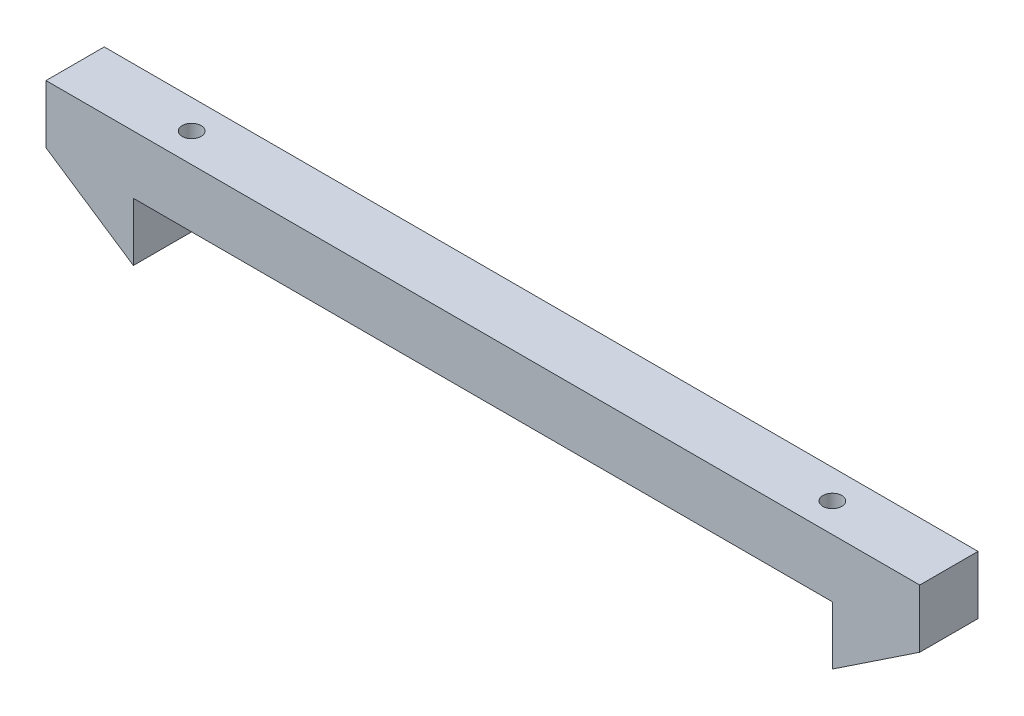
ISO-10303-21;
HEADER;
FILE_DESCRIPTION(('STEP AP214'),'2;1');
FILE_NAME('part.step','',(''),(''),'','','');
FILE_SCHEMA(('AUTOMOTIVE_DESIGN { 1 0 10303 214 1 1 1 1 }'));
ENDSEC;
DATA;
#1=APPLICATION_CONTEXT('core data for automotive mechanical design processes');
#2=APPLICATION_PROTOCOL_DEFINITION('international standard','automotive_design',2000,#1);
#3=PRODUCT_CONTEXT('',#1,'mechanical');
#4=PRODUCT('Part','Part','',(#3));
#5=PRODUCT_RELATED_PRODUCT_CATEGORY('part','',(#4));
#6=PRODUCT_DEFINITION_FORMATION('','',#4);
#7=PRODUCT_DEFINITION_CONTEXT('part definition',#1,'design');
#8=PRODUCT_DEFINITION('design','',#6,#7);
#9=PRODUCT_DEFINITION_SHAPE('','',#8);
#10=(LENGTH_UNIT() NAMED_UNIT(*) SI_UNIT(.MILLI.,.METRE.));
#11=(NAMED_UNIT(*) PLANE_ANGLE_UNIT() SI_UNIT($,.RADIAN.));
#12=(NAMED_UNIT(*) SI_UNIT($,.STERADIAN.) SOLID_ANGLE_UNIT());
#13=UNCERTAINTY_MEASURE_WITH_UNIT(LENGTH_MEASURE(1.E-05),#10,'distance_accuracy_value','');
#14=(GEOMETRIC_REPRESENTATION_CONTEXT(3) GLOBAL_UNCERTAINTY_ASSIGNED_CONTEXT((#13)) GLOBAL_UNIT_ASSIGNED_CONTEXT((#10,
#11,#12)) REPRESENTATION_CONTEXT('',''));
#15=CARTESIAN_POINT('',(0.,0.,0.));
#16=DIRECTION('',(0.,0.,1.));
#17=DIRECTION('',(1.,0.,0.));
#18=AXIS2_PLACEMENT_3D('',#15,#16,#17);
#19=CARTESIAN_POINT('',(-48.,-8.00000000000001,8.));
#20=DIRECTION('',(-1.,0.,0.));
#21=DIRECTION('',(0.,0.,1.));
#22=AXIS2_PLACEMENT_3D('',#19,#20,#21);
#23=PLANE('',#22);
#24=DIRECTION('',(0.,1.,0.));
#25=VECTOR('',#24,1.);
#26=CARTESIAN_POINT('',(-48.,-8.00000000000001,0.));
#27=LINE('',#26,#25);
#28=CARTESIAN_POINT('',(-48.,-8.00000000000001,0.));
#29=VERTEX_POINT('',#28);
#30=CARTESIAN_POINT('',(-48.,0.,0.));
#31=VERTEX_POINT('',#30);
#32=EDGE_CURVE('E145',#29,#31,#27,.T.);
#33=ORIENTED_EDGE('',*,*,#32,.T.);
#34=DIRECTION('',(0.,0.,-1.));
#35=VECTOR('',#34,1.);
#36=CARTESIAN_POINT('',(-48.,0.,8.));
#37=LINE('',#36,#35);
#38=CARTESIAN_POINT('',(-48.,0.,8.));
#39=VERTEX_POINT('',#38);
#40=EDGE_CURVE('E11',#39,#31,#37,.T.);
#41=ORIENTED_EDGE('',*,*,#40,.F.);
#42=DIRECTION('',(0.,1.,0.));
#43=VECTOR('',#42,1.);
#44=CARTESIAN_POINT('',(-48.,-8.00000000000001,8.));
#45=LINE('',#44,#43);
#46=CARTESIAN_POINT('',(-48.,-8.00000000000001,8.));
#47=VERTEX_POINT('',#46);
#48=EDGE_CURVE('E170',#47,#39,#45,.T.);
#49=ORIENTED_EDGE('',*,*,#48,.F.);
#50=DIRECTION('',(0.,0.,-1.));
#51=VECTOR('',#50,1.);
#52=CARTESIAN_POINT('',(-48.,-8.00000000000001,8.));
#53=LINE('',#52,#51);
#54=EDGE_CURVE('E137',#47,#29,#53,.T.);
#55=ORIENTED_EDGE('',*,*,#54,.T.);
#56=EDGE_LOOP('',(#33,#41,#49,#55));
#57=FACE_BOUND('',#56,.T.);
#58=ADVANCED_FACE('F43',(#57),#23,.F.);
#59=CARTESIAN_POINT('',(-48.,0.,8.));
#60=DIRECTION('',(0.,1.,0.));
#61=DIRECTION('',(-1.,0.,0.));
#62=AXIS2_PLACEMENT_3D('',#59,#60,#61);
#63=PLANE('',#62);
#64=CARTESIAN_POINT('',(-44.,0.,4.));
#65=DIRECTION('',(0.,-1.,0.));
#66=DIRECTION('',(1.,0.,0.));
#67=AXIS2_PLACEMENT_3D('',#64,#65,#66);
#68=CIRCLE('',#67,1.29999999999999);
#69=CARTESIAN_POINT('',(-42.7,0.,4.));
#70=VERTEX_POINT('',#69);
#71=EDGE_CURVE('E214',#70,#70,#68,.T.);
#72=ORIENTED_EDGE('',*,*,#71,.F.);
#73=EDGE_LOOP('',(#72));
#74=FACE_BOUND('',#73,.T.);
#75=CARTESIAN_POINT('',(44.,0.,4.));
#76=DIRECTION('',(0.,-1.,0.));
#77=DIRECTION('',(-1.,0.,0.));
#78=AXIS2_PLACEMENT_3D('',#75,#76,#77);
#79=CIRCLE('',#78,1.29999999999999);
#80=CARTESIAN_POINT('',(42.7,0.,4.));
#81=VERTEX_POINT('',#80);
#82=EDGE_CURVE('E211',#81,#81,#79,.T.);
#83=ORIENTED_EDGE('',*,*,#82,.F.);
#84=EDGE_LOOP('',(#83));
#85=FACE_BOUND('',#84,.T.);
#86=DIRECTION('',(1.,0.,0.));
#87=VECTOR('',#86,1.);
#88=CARTESIAN_POINT('',(-48.,0.,0.));
#89=LINE('',#88,#87);
#90=CARTESIAN_POINT('',(48.,0.,0.));
#91=VERTEX_POINT('',#90);
#92=EDGE_CURVE('E146',#31,#91,#89,.T.);
#93=ORIENTED_EDGE('',*,*,#92,.T.);
#94=DIRECTION('',(0.,0.,-1.));
#95=VECTOR('',#94,1.);
#96=CARTESIAN_POINT('',(48.,0.,8.));
#97=LINE('',#96,#95);
#98=CARTESIAN_POINT('',(48.,0.,8.));
#99=VERTEX_POINT('',#98);
#100=EDGE_CURVE('E55',#99,#91,#97,.T.);
#101=ORIENTED_EDGE('',*,*,#100,.F.);
#102=DIRECTION('',(1.,0.,0.));
#103=VECTOR('',#102,1.);
#104=CARTESIAN_POINT('',(-48.,0.,8.));
#105=LINE('',#104,#103);
#106=EDGE_CURVE('E103',#39,#99,#105,.T.);
#107=ORIENTED_EDGE('',*,*,#106,.F.);
#108=ORIENTED_EDGE('',*,*,#40,.T.);
#109=EDGE_LOOP('',(#93,#101,#107,#108));
#110=FACE_BOUND('',#109,.T.);
#111=ADVANCED_FACE('F228',(#74,#85,#110),#63,.F.);
#112=CARTESIAN_POINT('',(48.,0.,8.));
#113=DIRECTION('',(1.,0.,0.));
#114=DIRECTION('',(0.,0.,-1.));
#115=AXIS2_PLACEMENT_3D('',#112,#113,#114);
#116=PLANE('',#115);
#117=DIRECTION('',(0.,-1.,0.));
#118=VECTOR('',#117,1.);
#119=CARTESIAN_POINT('',(48.,0.,0.));
#120=LINE('',#119,#118);
#121=CARTESIAN_POINT('',(48.,-7.99999999999998,0.));
#122=VERTEX_POINT('',#121);
#123=EDGE_CURVE('E155',#91,#122,#120,.T.);
#124=ORIENTED_EDGE('',*,*,#123,.T.);
#125=DIRECTION('',(0.,0.,-1.));
#126=VECTOR('',#125,1.);
#127=CARTESIAN_POINT('',(48.,-7.99999999999998,8.));
#128=LINE('',#127,#126);
#129=CARTESIAN_POINT('',(48.,-7.99999999999998,8.));
#130=VERTEX_POINT('',#129);
#131=EDGE_CURVE('E176',#130,#122,#128,.T.);
#132=ORIENTED_EDGE('',*,*,#131,.F.);
#133=DIRECTION('',(0.,-1.,0.));
#134=VECTOR('',#133,1.);
#135=CARTESIAN_POINT('',(48.,0.,8.));
#136=LINE('',#135,#134);
#137=EDGE_CURVE('E189',#99,#130,#136,.T.);
#138=ORIENTED_EDGE('',*,*,#137,.F.);
#139=ORIENTED_EDGE('',*,*,#100,.T.);
#140=EDGE_LOOP('',(#124,#132,#138,#139));
#141=FACE_BOUND('',#140,.T.);
#142=ADVANCED_FACE('F187',(#141),#116,.F.);
#143=CARTESIAN_POINT('',(48.,-7.99999999999998,8.));
#144=DIRECTION('',(-0.554700196225229,0.832050294337844,0.));
#145=DIRECTION('',(-0.832050294337844,-0.554700196225229,0.));
#146=AXIS2_PLACEMENT_3D('',#143,#144,#145);
#147=PLANE('',#146);
#148=DIRECTION('',(0.832050294337844,0.554700196225229,0.));
#149=VECTOR('',#148,1.);
#150=CARTESIAN_POINT('',(48.,-7.99999999999998,0.));
#151=LINE('',#150,#149);
#152=CARTESIAN_POINT('',(60.,0.,0.));
#153=VERTEX_POINT('',#152);
#154=EDGE_CURVE('E154',#122,#153,#151,.T.);
#155=ORIENTED_EDGE('',*,*,#154,.T.);
#156=DIRECTION('',(0.,0.,-1.));
#157=VECTOR('',#156,1.);
#158=CARTESIAN_POINT('',(60.,0.,8.));
#159=LINE('',#158,#157);
#160=CARTESIAN_POINT('',(60.,0.,8.));
#161=VERTEX_POINT('',#160);
#162=EDGE_CURVE('E171',#161,#153,#159,.T.);
#163=ORIENTED_EDGE('',*,*,#162,.F.);
#164=DIRECTION('',(0.832050294337844,0.554700196225229,0.));
#165=VECTOR('',#164,1.);
#166=CARTESIAN_POINT('',(48.,-7.99999999999998,8.));
#167=LINE('',#166,#165);
#168=EDGE_CURVE('E203',#130,#161,#167,.T.);
#169=ORIENTED_EDGE('',*,*,#168,.F.);
#170=ORIENTED_EDGE('',*,*,#131,.T.);
#171=EDGE_LOOP('',(#155,#163,#169,#170));
#172=FACE_BOUND('',#171,.T.);
#173=ADVANCED_FACE('F198',(#172),#147,.F.);
#174=CARTESIAN_POINT('',(60.,0.,8.));
#175=DIRECTION('',(-1.,0.,0.));
#176=DIRECTION('',(0.,0.,1.));
#177=AXIS2_PLACEMENT_3D('',#174,#175,#176);
#178=PLANE('',#177);
#179=DIRECTION('',(0.,1.,0.));
#180=VECTOR('',#179,1.);
#181=CARTESIAN_POINT('',(60.,0.,0.));
#182=LINE('',#181,#180);
#183=CARTESIAN_POINT('',(60.,8.00000000000002,0.));
#184=VERTEX_POINT('',#183);
#185=EDGE_CURVE('E158',#153,#184,#182,.T.);
#186=ORIENTED_EDGE('',*,*,#185,.T.);
#187=DIRECTION('',(0.,0.,-1.));
#188=VECTOR('',#187,1.);
#189=CARTESIAN_POINT('',(60.,8.00000000000002,8.));
#190=LINE('',#189,#188);
#191=CARTESIAN_POINT('',(60.,8.00000000000002,8.));
#192=VERTEX_POINT('',#191);
#193=EDGE_CURVE('E134',#192,#184,#190,.T.);
#194=ORIENTED_EDGE('',*,*,#193,.F.);
#195=DIRECTION('',(0.,1.,0.));
#196=VECTOR('',#195,1.);
#197=CARTESIAN_POINT('',(60.,0.,8.));
#198=LINE('',#197,#196);
#199=EDGE_CURVE('E125',#161,#192,#198,.T.);
#200=ORIENTED_EDGE('',*,*,#199,.F.);
#201=ORIENTED_EDGE('',*,*,#162,.T.);
#202=EDGE_LOOP('',(#186,#194,#200,#201));
#203=FACE_BOUND('',#202,.T.);
#204=ADVANCED_FACE('F200',(#203),#178,.F.);
#205=CARTESIAN_POINT('',(60.,8.00000000000002,8.));
#206=DIRECTION('',(0.,-1.,0.));
#207=DIRECTION('',(0.,0.,-1.));
#208=AXIS2_PLACEMENT_3D('',#205,#206,#207);
#209=PLANE('',#208);
#210=CARTESIAN_POINT('',(-44.,8.00000000000002,4.));
#211=DIRECTION('',(0.,-1.,0.));
#212=DIRECTION('',(0.,0.,-1.));
#213=AXIS2_PLACEMENT_3D('',#210,#211,#212);
#214=CIRCLE('',#213,1.29999999999999);
#215=CARTESIAN_POINT('',(-44.,8.00000000000002,2.70000000000001));
#216=VERTEX_POINT('',#215);
#217=EDGE_CURVE('E149',#216,#216,#214,.F.);
#218=ORIENTED_EDGE('',*,*,#217,.F.);
#219=EDGE_LOOP('',(#218));
#220=FACE_BOUND('',#219,.T.);
#221=CARTESIAN_POINT('',(44.,8.00000000000002,4.));
#222=DIRECTION('',(0.,-1.,0.));
#223=DIRECTION('',(0.,0.,-1.));
#224=AXIS2_PLACEMENT_3D('',#221,#222,#223);
#225=CIRCLE('',#224,1.29999999999999);
#226=CARTESIAN_POINT('',(44.,8.00000000000002,2.70000000000001));
#227=VERTEX_POINT('',#226);
#228=EDGE_CURVE('E216',#227,#227,#225,.F.);
#229=ORIENTED_EDGE('',*,*,#228,.F.);
#230=EDGE_LOOP('',(#229));
#231=FACE_BOUND('',#230,.T.);
#232=DIRECTION('',(-1.,0.,0.));
#233=VECTOR('',#232,1.);
#234=CARTESIAN_POINT('',(60.,8.00000000000002,0.));
#235=LINE('',#234,#233);
#236=CARTESIAN_POINT('',(-60.,8.00000000000002,0.));
#237=VERTEX_POINT('',#236);
#238=EDGE_CURVE('E132',#184,#237,#235,.T.);
#239=ORIENTED_EDGE('',*,*,#238,.T.);
#240=DIRECTION('',(0.,0.,-1.));
#241=VECTOR('',#240,1.);
#242=CARTESIAN_POINT('',(-60.,8.00000000000002,8.));
#243=LINE('',#242,#241);
#244=CARTESIAN_POINT('',(-60.,8.00000000000002,8.));
#245=VERTEX_POINT('',#244);
#246=EDGE_CURVE('E126',#245,#237,#243,.T.);
#247=ORIENTED_EDGE('',*,*,#246,.F.);
#248=DIRECTION('',(-1.,0.,0.));
#249=VECTOR('',#248,1.);
#250=CARTESIAN_POINT('',(60.,8.00000000000002,8.));
#251=LINE('',#250,#249);
#252=EDGE_CURVE('E117',#192,#245,#251,.T.);
#253=ORIENTED_EDGE('',*,*,#252,.F.);
#254=ORIENTED_EDGE('',*,*,#193,.T.);
#255=EDGE_LOOP('',(#239,#247,#253,#254));
#256=FACE_BOUND('',#255,.T.);
#257=ADVANCED_FACE('F129',(#220,#231,#256),#209,.F.);
#258=CARTESIAN_POINT('',(-60.,8.00000000000002,8.));
#259=DIRECTION('',(1.,0.,0.));
#260=DIRECTION('',(0.,0.,-1.));
#261=AXIS2_PLACEMENT_3D('',#258,#259,#260);
#262=PLANE('',#261);
#263=DIRECTION('',(0.,-1.,0.));
#264=VECTOR('',#263,1.);
#265=CARTESIAN_POINT('',(-60.,8.00000000000002,0.));
#266=LINE('',#265,#264);
#267=CARTESIAN_POINT('',(-60.,0.,0.));
#268=VERTEX_POINT('',#267);
#269=EDGE_CURVE('E90',#237,#268,#266,.T.);
#270=ORIENTED_EDGE('',*,*,#269,.T.);
#271=DIRECTION('',(0.,0.,-1.));
#272=VECTOR('',#271,1.);
#273=CARTESIAN_POINT('',(-60.,0.,8.));
#274=LINE('',#273,#272);
#275=CARTESIAN_POINT('',(-60.,0.,8.));
#276=VERTEX_POINT('',#275);
#277=EDGE_CURVE('E131',#276,#268,#274,.T.);
#278=ORIENTED_EDGE('',*,*,#277,.F.);
#279=DIRECTION('',(0.,-1.,0.));
#280=VECTOR('',#279,1.);
#281=CARTESIAN_POINT('',(-60.,8.00000000000002,8.));
#282=LINE('',#281,#280);
#283=EDGE_CURVE('E118',#245,#276,#282,.T.);
#284=ORIENTED_EDGE('',*,*,#283,.F.);
#285=ORIENTED_EDGE('',*,*,#246,.T.);
#286=EDGE_LOOP('',(#270,#278,#284,#285));
#287=FACE_BOUND('',#286,.T.);
#288=ADVANCED_FACE('F138',(#287),#262,.F.);
#289=CARTESIAN_POINT('',(-60.,0.,8.));
#290=DIRECTION('',(0.554700196225231,0.832050294337843,0.));
#291=DIRECTION('',(-0.832050294337843,0.554700196225231,0.));
#292=AXIS2_PLACEMENT_3D('',#289,#290,#291);
#293=PLANE('',#292);
#294=DIRECTION('',(0.832050294337843,-0.554700196225231,0.));
#295=VECTOR('',#294,1.);
#296=CARTESIAN_POINT('',(-60.,0.,0.));
#297=LINE('',#296,#295);
#298=EDGE_CURVE('E92',#268,#29,#297,.T.);
#299=ORIENTED_EDGE('',*,*,#298,.T.);
#300=ORIENTED_EDGE('',*,*,#54,.F.);
#301=DIRECTION('',(0.832050294337843,-0.554700196225231,0.));
#302=VECTOR('',#301,1.);
#303=CARTESIAN_POINT('',(-60.,0.,8.));
#304=LINE('',#303,#302);
#305=EDGE_CURVE('E58',#276,#47,#304,.T.);
#306=ORIENTED_EDGE('',*,*,#305,.F.);
#307=ORIENTED_EDGE('',*,*,#277,.T.);
#308=EDGE_LOOP('',(#299,#300,#306,#307));
#309=FACE_BOUND('',#308,.T.);
#310=ADVANCED_FACE('F240',(#309),#293,.F.);
#311=CARTESIAN_POINT('',(0.,0.,8.));
#312=DIRECTION('',(0.,0.,-1.));
#313=DIRECTION('',(-1.,0.,0.));
#314=AXIS2_PLACEMENT_3D('',#311,#312,#313);
#315=PLANE('',#314);
#316=ORIENTED_EDGE('',*,*,#48,.T.);
#317=ORIENTED_EDGE('',*,*,#106,.T.);
#318=ORIENTED_EDGE('',*,*,#137,.T.);
#319=ORIENTED_EDGE('',*,*,#168,.T.);
#320=ORIENTED_EDGE('',*,*,#199,.T.);
#321=ORIENTED_EDGE('',*,*,#252,.T.);
#322=ORIENTED_EDGE('',*,*,#283,.T.);
#323=ORIENTED_EDGE('',*,*,#305,.T.);
#324=EDGE_LOOP('',(#316,#317,#318,#319,#320,#321,#322,#323));
#325=FACE_BOUND('',#324,.T.);
#326=ADVANCED_FACE('F119',(#325),#315,.F.);
#327=CARTESIAN_POINT('',(0.,0.,0.));
#328=DIRECTION('',(0.,0.,-1.));
#329=DIRECTION('',(-1.,0.,0.));
#330=AXIS2_PLACEMENT_3D('',#327,#328,#329);
#331=PLANE('',#330);
#332=ORIENTED_EDGE('',*,*,#32,.F.);
#333=ORIENTED_EDGE('',*,*,#298,.F.);
#334=ORIENTED_EDGE('',*,*,#269,.F.);
#335=ORIENTED_EDGE('',*,*,#238,.F.);
#336=ORIENTED_EDGE('',*,*,#185,.F.);
#337=ORIENTED_EDGE('',*,*,#154,.F.);
#338=ORIENTED_EDGE('',*,*,#123,.F.);
#339=ORIENTED_EDGE('',*,*,#92,.F.);
#340=EDGE_LOOP('',(#332,#333,#334,#335,#336,#337,#338,#339));
#341=FACE_BOUND('',#340,.T.);
#342=ADVANCED_FACE('F195',(#341),#331,.T.);
#343=CARTESIAN_POINT('',(44.,8.00100000000002,4.));
#344=DIRECTION('',(0.,-1.,0.));
#345=DIRECTION('',(1.,0.,0.));
#346=AXIS2_PLACEMENT_3D('',#343,#344,#345);
#347=CYLINDRICAL_SURFACE('',#346,1.29999999999999);
#348=ORIENTED_EDGE('',*,*,#82,.T.);
#349=EDGE_LOOP('',(#348));
#350=FACE_BOUND('',#349,.T.);
#351=ORIENTED_EDGE('',*,*,#228,.T.);
#352=EDGE_LOOP('',(#351));
#353=FACE_BOUND('',#352,.T.);
#354=ADVANCED_FACE('F305',(#350,#353),#347,.F.);
#355=CARTESIAN_POINT('',(-44.,8.00100000000002,4.));
#356=DIRECTION('',(0.,-1.,0.));
#357=DIRECTION('',(1.,0.,0.));
#358=AXIS2_PLACEMENT_3D('',#355,#356,#357);
#359=CYLINDRICAL_SURFACE('',#358,1.29999999999999);
#360=ORIENTED_EDGE('',*,*,#71,.T.);
#361=EDGE_LOOP('',(#360));
#362=FACE_BOUND('',#361,.T.);
#363=ORIENTED_EDGE('',*,*,#217,.T.);
#364=EDGE_LOOP('',(#363));
#365=FACE_BOUND('',#364,.T.);
#366=ADVANCED_FACE('F230',(#362,#365),#359,.F.);
#367=CLOSED_SHELL('',(#58,#111,#142,#173,#204,#257,#288,#310,#326,#342,#354,#366));
#368=MANIFOLD_SOLID_BREP('B2',#367);
#369=ADVANCED_BREP_SHAPE_REPRESENTATION('',(#18,#368),#14);
#370=SHAPE_DEFINITION_REPRESENTATION(#9,#369);
ENDSEC;
END-ISO-10303-21;
